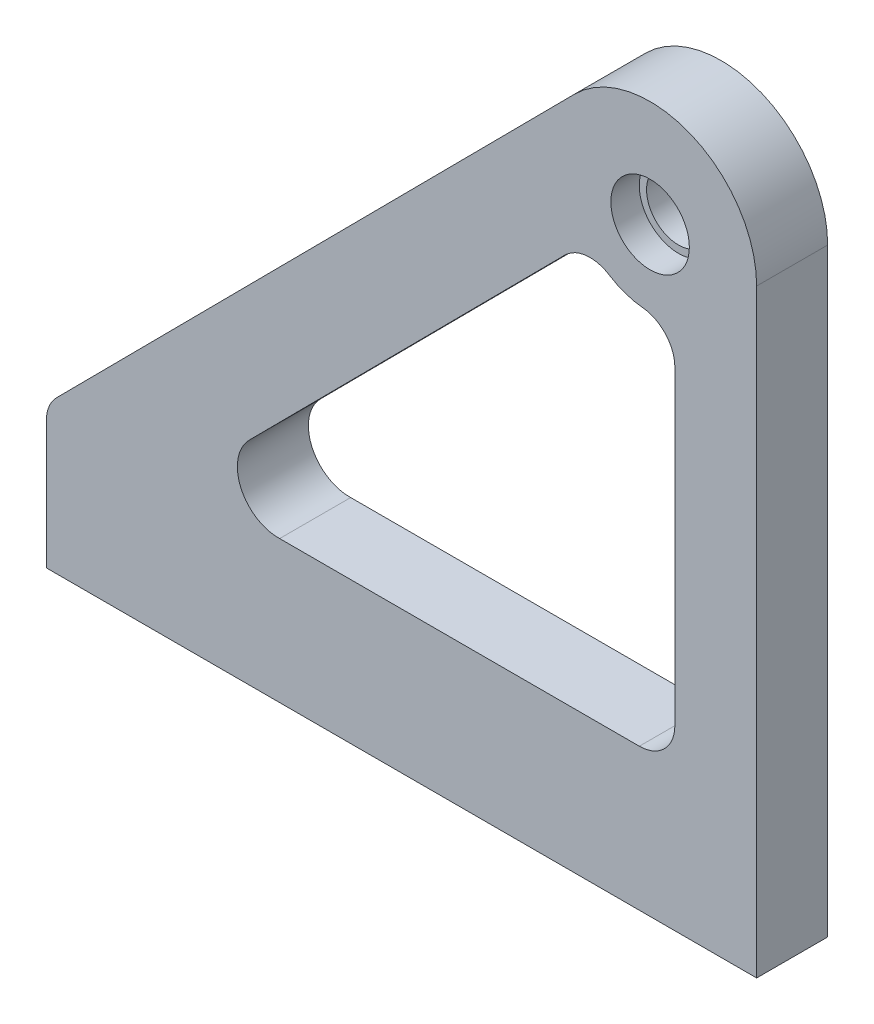
ISO-10303-21;
HEADER;
FILE_DESCRIPTION(('STEP AP214'),'2;1');
FILE_NAME('part.step','',(''),(''),'','','');
FILE_SCHEMA(('AUTOMOTIVE_DESIGN { 1 0 10303 214 1 1 1 1 }'));
ENDSEC;
DATA;
#1=APPLICATION_CONTEXT('core data for automotive mechanical design processes');
#2=APPLICATION_PROTOCOL_DEFINITION('international standard','automotive_design',2000,#1);
#3=PRODUCT_CONTEXT('',#1,'mechanical');
#4=PRODUCT('Part','Part','',(#3));
#5=PRODUCT_RELATED_PRODUCT_CATEGORY('part','',(#4));
#6=PRODUCT_DEFINITION_FORMATION('','',#4);
#7=PRODUCT_DEFINITION_CONTEXT('part definition',#1,'design');
#8=PRODUCT_DEFINITION('design','',#6,#7);
#9=PRODUCT_DEFINITION_SHAPE('','',#8);
#10=(LENGTH_UNIT() NAMED_UNIT(*) SI_UNIT(.MILLI.,.METRE.));
#11=(NAMED_UNIT(*) PLANE_ANGLE_UNIT() SI_UNIT($,.RADIAN.));
#12=(NAMED_UNIT(*) SI_UNIT($,.STERADIAN.) SOLID_ANGLE_UNIT());
#13=UNCERTAINTY_MEASURE_WITH_UNIT(LENGTH_MEASURE(1.E-05),#10,'distance_accuracy_value','');
#14=(GEOMETRIC_REPRESENTATION_CONTEXT(3) GLOBAL_UNCERTAINTY_ASSIGNED_CONTEXT((#13)) GLOBAL_UNIT_ASSIGNED_CONTEXT((#10,
#11,#12)) REPRESENTATION_CONTEXT('',''));
#15=CARTESIAN_POINT('',(0.,0.,0.));
#16=DIRECTION('',(0.,0.,1.));
#17=DIRECTION('',(1.,0.,0.));
#18=AXIS2_PLACEMENT_3D('',#15,#16,#17);
#19=CARTESIAN_POINT('',(-3.62562974974338,66.9384716413965,10.));
#20=DIRECTION('',(0.,0.,-1.));
#21=DIRECTION('',(-1.,0.,0.));
#22=AXIS2_PLACEMENT_3D('',#19,#20,#21);
#23=CYLINDRICAL_SURFACE('',#22,5.52500000000007);
#24=CARTESIAN_POINT('',(-3.62562974974338,66.9384716413965,10.));
#25=DIRECTION('',(0.,0.,1.));
#26=DIRECTION('',(1.,0.,0.));
#27=AXIS2_PLACEMENT_3D('',#24,#25,#26);
#28=CIRCLE('',#27,5.52500000000007);
#29=CARTESIAN_POINT('',(1.89937025025669,66.9384716413965,10.));
#30=VERTEX_POINT('',#29);
#31=EDGE_CURVE('E197',#30,#30,#28,.T.);
#32=ORIENTED_EDGE('',*,*,#31,.T.);
#33=EDGE_LOOP('',(#32));
#34=FACE_BOUND('',#33,.T.);
#35=CARTESIAN_POINT('',(-3.62562974974338,66.9384716413965,6.));
#36=DIRECTION('',(0.,0.,-1.));
#37=DIRECTION('',(-1.,0.,0.));
#38=AXIS2_PLACEMENT_3D('',#35,#36,#37);
#39=CIRCLE('',#38,5.52500000000006);
#40=CARTESIAN_POINT('',(-9.15062974974344,66.9384716413965,6.));
#41=VERTEX_POINT('',#40);
#42=EDGE_CURVE('E179',#41,#41,#39,.T.);
#43=ORIENTED_EDGE('',*,*,#42,.T.);
#44=EDGE_LOOP('',(#43));
#45=FACE_BOUND('',#44,.T.);
#46=ADVANCED_FACE('F41',(#34,#45),#23,.F.);
#47=CARTESIAN_POINT('',(-83.6256297497434,0.527091372309415,10.));
#48=DIRECTION('',(0.,0.,-1.));
#49=DIRECTION('',(-1.,0.,0.));
#50=AXIS2_PLACEMENT_3D('',#47,#48,#49);
#51=PLANE('',#50);
#52=DIRECTION('',(0.,-1.,0.));
#53=VECTOR('',#52,1.);
#54=CARTESIAN_POINT('',(-88.6256297497434,-17.4255036025863,10.));
#55=LINE('',#54,#53);
#56=CARTESIAN_POINT('',(-88.6256297497434,0.527091372309415,10.));
#57=VERTEX_POINT('',#56);
#58=CARTESIAN_POINT('',(-88.6256297497434,-17.4255036025863,10.));
#59=VERTEX_POINT('',#58);
#60=EDGE_CURVE('E285',#57,#59,#55,.T.);
#61=ORIENTED_EDGE('',*,*,#60,.T.);
#62=DIRECTION('',(1.,0.,0.));
#63=VECTOR('',#62,1.);
#64=CARTESIAN_POINT('',(-88.6256297497434,-17.4255036025863,10.));
#65=LINE('',#64,#63);
#66=CARTESIAN_POINT('',(11.3743702502566,-17.4255036025863,10.));
#67=VERTEX_POINT('',#66);
#68=EDGE_CURVE('E289',#59,#67,#65,.T.);
#69=ORIENTED_EDGE('',*,*,#68,.T.);
#70=DIRECTION('',(0.,1.,0.));
#71=VECTOR('',#70,1.);
#72=CARTESIAN_POINT('',(11.3743702502566,-17.4255036025863,10.));
#73=LINE('',#72,#71);
#74=CARTESIAN_POINT('',(11.3743702502566,66.9384716413965,10.));
#75=VERTEX_POINT('',#74);
#76=EDGE_CURVE('E293',#67,#75,#73,.T.);
#77=ORIENTED_EDGE('',*,*,#76,.T.);
#78=CARTESIAN_POINT('',(-3.62562974974338,66.9384716413965,10.));
#79=DIRECTION('',(0.,0.,1.));
#80=DIRECTION('',(1.,0.,0.));
#81=AXIS2_PLACEMENT_3D('',#78,#79,#80);
#82=CIRCLE('',#81,15.);
#83=CARTESIAN_POINT('',(-14.2722614936325,77.504891683682,10.));
#84=VERTEX_POINT('',#83);
#85=EDGE_CURVE('E296',#75,#84,#82,.T.);
#86=ORIENTED_EDGE('',*,*,#85,.T.);
#87=DIRECTION('',(-0.704428002819035,-0.709775449592606,0.));
#88=VECTOR('',#87,1.);
#89=CARTESIAN_POINT('',(-87.1745069977064,4.04923138640459,10.));
#90=LINE('',#89,#88);
#91=CARTESIAN_POINT('',(-87.1745069977064,4.04923138640459,10.));
#92=VERTEX_POINT('',#91);
#93=EDGE_CURVE('E299',#84,#92,#90,.T.);
#94=ORIENTED_EDGE('',*,*,#93,.T.);
#95=CARTESIAN_POINT('',(-83.6256297497434,0.527091372309415,10.));
#96=DIRECTION('',(0.,0.,1.));
#97=DIRECTION('',(-1.,0.,0.));
#98=AXIS2_PLACEMENT_3D('',#95,#96,#97);
#99=CIRCLE('',#98,5.);
#100=EDGE_CURVE('E302',#92,#57,#99,.T.);
#101=ORIENTED_EDGE('',*,*,#100,.T.);
#102=EDGE_LOOP('',(#61,#69,#77,#86,#94,#101));
#103=FACE_BOUND('',#102,.T.);
#104=CARTESIAN_POINT('',(-5.14203047411465,7.57449639741371,10.));
#105=DIRECTION('',(0.,0.,1.));
#106=DIRECTION('',(-1.,0.,0.));
#107=AXIS2_PLACEMENT_3D('',#104,#105,#106);
#108=CIRCLE('',#107,5.);
#109=CARTESIAN_POINT('',(-5.14203047411465,2.57449639741371,10.));
#110=VERTEX_POINT('',#109);
#111=CARTESIAN_POINT('',(-0.142030474114648,7.57449639741371,10.));
#112=VERTEX_POINT('',#111);
#113=EDGE_CURVE('E202',#110,#112,#108,.T.);
#114=ORIENTED_EDGE('',*,*,#113,.F.);
#115=DIRECTION('',(1.,0.,0.));
#116=VECTOR('',#115,1.);
#117=CARTESIAN_POINT('',(-5.14203047411465,2.57449639741371,10.));
#118=LINE('',#117,#116);
#119=CARTESIAN_POINT('',(-55.7765199076576,2.57449639741371,10.));
#120=VERTEX_POINT('',#119);
#121=EDGE_CURVE('E225',#120,#110,#118,.T.);
#122=ORIENTED_EDGE('',*,*,#121,.F.);
#123=CARTESIAN_POINT('',(-55.9397183034417,8.36540097019559,10.));
#124=DIRECTION('',(0.,0.,1.));
#125=DIRECTION('',(-1.,0.,0.));
#126=AXIS2_PLACEMENT_3D('',#123,#124,#125);
#127=CIRCLE('',#126,5.79320373260362);
#128=CARTESIAN_POINT('',(-60.051592087332,12.4462959054773,10.));
#129=VERTEX_POINT('',#128);
#130=EDGE_CURVE('E221',#129,#120,#127,.T.);
#131=ORIENTED_EDGE('',*,*,#130,.F.);
#132=DIRECTION('',(-0.704428002819035,-0.709775449592606,0.));
#133=VECTOR('',#132,1.);
#134=CARTESIAN_POINT('',(-60.051592087332,12.4462959054773,10.));
#135=LINE('',#134,#133);
#136=CARTESIAN_POINT('',(-15.6209090929066,57.2142606540001,10.));
#137=VERTEX_POINT('',#136);
#138=EDGE_CURVE('E218',#137,#129,#135,.T.);
#139=ORIENTED_EDGE('',*,*,#138,.F.);
#140=CARTESIAN_POINT('',(-12.0720318449436,53.6921206399049,10.));
#141=DIRECTION('',(0.,0.,1.));
#142=DIRECTION('',(-1.,0.,0.));
#143=AXIS2_PLACEMENT_3D('',#140,#141,#142);
#144=CIRCLE('',#143,4.99999999999999);
#145=CARTESIAN_POINT('',(-9.38382575983824,57.9079892389012,10.));
#146=VERTEX_POINT('',#145);
#147=EDGE_CURVE('E215',#146,#137,#144,.T.);
#148=ORIENTED_EDGE('',*,*,#147,.F.);
#149=CARTESIAN_POINT('',(-3.62562974974338,66.9384716413965,10.));
#150=DIRECTION('',(0.,0.,-1.));
#151=DIRECTION('',(1.,0.,0.));
#152=AXIS2_PLACEMENT_3D('',#149,#150,#151);
#153=CIRCLE('',#152,10.7101089496069);
#154=CARTESIAN_POINT('',(-4.65941105714071,56.2783717393822,10.));
#155=VERTEX_POINT('',#154);
#156=EDGE_CURVE('E212',#155,#146,#153,.T.);
#157=ORIENTED_EDGE('',*,*,#156,.F.);
#158=CARTESIAN_POINT('',(-5.14203047411465,51.3017183961846,10.));
#159=DIRECTION('',(0.,0.,1.));
#160=DIRECTION('',(1.,0.,0.));
#161=AXIS2_PLACEMENT_3D('',#158,#159,#160);
#162=CIRCLE('',#161,5.);
#163=CARTESIAN_POINT('',(-0.142030474114655,51.3017183961846,10.));
#164=VERTEX_POINT('',#163);
#165=EDGE_CURVE('E209',#164,#155,#162,.T.);
#166=ORIENTED_EDGE('',*,*,#165,.F.);
#167=DIRECTION('',(0.,1.,0.));
#168=VECTOR('',#167,1.);
#169=CARTESIAN_POINT('',(-0.142030474114655,51.3017183961846,10.));
#170=LINE('',#169,#168);
#171=EDGE_CURVE('E205',#112,#164,#170,.T.);
#172=ORIENTED_EDGE('',*,*,#171,.F.);
#173=EDGE_LOOP('',(#114,#122,#131,#139,#148,#157,#166,#172));
#174=FACE_BOUND('',#173,.T.);
#175=ORIENTED_EDGE('',*,*,#31,.F.);
#176=EDGE_LOOP('',(#175));
#177=FACE_BOUND('',#176,.T.);
#178=ADVANCED_FACE('F381',(#103,#174,#177),#51,.F.);
#179=CARTESIAN_POINT('',(-83.6256297497434,0.527091372309415,0.));
#180=DIRECTION('',(0.,0.,-1.));
#181=DIRECTION('',(-1.,0.,0.));
#182=AXIS2_PLACEMENT_3D('',#179,#180,#181);
#183=PLANE('',#182);
#184=DIRECTION('',(0.,-1.,0.));
#185=VECTOR('',#184,1.);
#186=CARTESIAN_POINT('',(-74.1517472077,-10.4255036025863,0.));
#187=LINE('',#186,#185);
#188=CARTESIAN_POINT('',(-74.1517472077,-10.4255036025863,0.));
#189=VERTEX_POINT('',#188);
#190=CARTESIAN_POINT('',(-74.1517472077,-17.4255036025863,0.));
#191=VERTEX_POINT('',#190);
#192=EDGE_CURVE('E65',#189,#191,#187,.T.);
#193=ORIENTED_EDGE('',*,*,#192,.F.);
#194=DIRECTION('',(-1.,0.,0.));
#195=VECTOR('',#194,1.);
#196=CARTESIAN_POINT('',(-83.6256297497434,-10.4255036025863,0.));
#197=LINE('',#196,#195);
#198=CARTESIAN_POINT('',(-83.0995122917867,-10.4255036025863,0.));
#199=VERTEX_POINT('',#198);
#200=EDGE_CURVE('E11',#189,#199,#197,.T.);
#201=ORIENTED_EDGE('',*,*,#200,.T.);
#202=DIRECTION('',(0.,-1.,0.));
#203=VECTOR('',#202,1.);
#204=CARTESIAN_POINT('',(-83.0995122917867,-10.4255036025863,0.));
#205=LINE('',#204,#203);
#206=CARTESIAN_POINT('',(-83.0995122917867,-17.4255036025863,0.));
#207=VERTEX_POINT('',#206);
#208=EDGE_CURVE('E187',#207,#199,#205,.F.);
#209=ORIENTED_EDGE('',*,*,#208,.F.);
#210=DIRECTION('',(1.,0.,0.));
#211=VECTOR('',#210,1.);
#212=CARTESIAN_POINT('',(-88.6256297497434,-17.4255036025863,0.));
#213=LINE('',#212,#211);
#214=CARTESIAN_POINT('',(-88.6256297497434,-17.4255036025863,0.));
#215=VERTEX_POINT('',#214);
#216=EDGE_CURVE('E309',#215,#207,#213,.T.);
#217=ORIENTED_EDGE('',*,*,#216,.F.);
#218=DIRECTION('',(0.,-1.,0.));
#219=VECTOR('',#218,1.);
#220=CARTESIAN_POINT('',(-88.6256297497434,-17.4255036025863,0.));
#221=LINE('',#220,#219);
#222=CARTESIAN_POINT('',(-88.6256297497434,0.527091372309415,0.));
#223=VERTEX_POINT('',#222);
#224=EDGE_CURVE('E284',#223,#215,#221,.T.);
#225=ORIENTED_EDGE('',*,*,#224,.F.);
#226=CARTESIAN_POINT('',(-83.6256297497434,0.527091372309415,0.));
#227=DIRECTION('',(0.,0.,1.));
#228=DIRECTION('',(-1.,0.,0.));
#229=AXIS2_PLACEMENT_3D('',#226,#227,#228);
#230=CIRCLE('',#229,5.);
#231=CARTESIAN_POINT('',(-87.1745069977064,4.04923138640459,0.));
#232=VERTEX_POINT('',#231);
#233=EDGE_CURVE('E290',#232,#223,#230,.T.);
#234=ORIENTED_EDGE('',*,*,#233,.F.);
#235=DIRECTION('',(-0.704428002819035,-0.709775449592606,0.));
#236=VECTOR('',#235,1.);
#237=CARTESIAN_POINT('',(-87.1745069977064,4.04923138640459,0.));
#238=LINE('',#237,#236);
#239=CARTESIAN_POINT('',(-14.2722614936325,77.504891683682,0.));
#240=VERTEX_POINT('',#239);
#241=EDGE_CURVE('E320',#240,#232,#238,.T.);
#242=ORIENTED_EDGE('',*,*,#241,.F.);
#243=CARTESIAN_POINT('',(-3.62562974974338,66.9384716413965,0.));
#244=DIRECTION('',(0.,0.,1.));
#245=DIRECTION('',(1.,0.,0.));
#246=AXIS2_PLACEMENT_3D('',#243,#244,#245);
#247=CIRCLE('',#246,15.);
#248=CARTESIAN_POINT('',(11.3743702502566,66.9384716413965,0.));
#249=VERTEX_POINT('',#248);
#250=EDGE_CURVE('E317',#249,#240,#247,.T.);
#251=ORIENTED_EDGE('',*,*,#250,.F.);
#252=DIRECTION('',(0.,1.,0.));
#253=VECTOR('',#252,1.);
#254=CARTESIAN_POINT('',(11.3743702502566,2.5744963974137,0.));
#255=LINE('',#254,#253);
#256=CARTESIAN_POINT('',(11.3743702502566,-17.4255036025863,0.));
#257=VERTEX_POINT('',#256);
#258=EDGE_CURVE('E313',#257,#249,#255,.T.);
#259=ORIENTED_EDGE('',*,*,#258,.F.);
#260=CARTESIAN_POINT('',(5.84825279229994,-17.4255036025863,0.));
#261=VERTEX_POINT('',#260);
#262=EDGE_CURVE('E185',#261,#257,#213,.T.);
#263=ORIENTED_EDGE('',*,*,#262,.F.);
#264=DIRECTION('',(0.,-1.,0.));
#265=VECTOR('',#264,1.);
#266=CARTESIAN_POINT('',(5.84825279229994,-10.4255036025863,0.));
#267=LINE('',#266,#265);
#268=CARTESIAN_POINT('',(5.84825279229994,-10.4255036025863,0.));
#269=VERTEX_POINT('',#268);
#270=EDGE_CURVE('E57',#269,#261,#267,.T.);
#271=ORIENTED_EDGE('',*,*,#270,.F.);
#272=DIRECTION('',(-1.,0.,0.));
#273=VECTOR('',#272,1.);
#274=CARTESIAN_POINT('',(-83.6256297497434,-10.4255036025863,0.));
#275=LINE('',#274,#273);
#276=CARTESIAN_POINT('',(-3.0995122917867,-10.4255036025863,0.));
#277=VERTEX_POINT('',#276);
#278=EDGE_CURVE('E50',#269,#277,#275,.T.);
#279=ORIENTED_EDGE('',*,*,#278,.T.);
#280=DIRECTION('',(0.,-1.,0.));
#281=VECTOR('',#280,1.);
#282=CARTESIAN_POINT('',(-3.0995122917867,-10.4255036025863,0.));
#283=LINE('',#282,#281);
#284=CARTESIAN_POINT('',(-3.0995122917867,-17.4255036025863,0.));
#285=VERTEX_POINT('',#284);
#286=EDGE_CURVE('E176',#285,#277,#283,.F.);
#287=ORIENTED_EDGE('',*,*,#286,.F.);
#288=EDGE_CURVE('E314',#191,#285,#213,.T.);
#289=ORIENTED_EDGE('',*,*,#288,.F.);
#290=EDGE_LOOP('',(#193,#201,#209,#217,#225,#234,#242,#251,#259,#263,#271,#279,#287,#289));
#291=FACE_BOUND('',#290,.T.);
#292=DIRECTION('',(1.,0.,0.));
#293=VECTOR('',#292,1.);
#294=CARTESIAN_POINT('',(-5.14203047411465,2.57449639741371,0.));
#295=LINE('',#294,#293);
#296=CARTESIAN_POINT('',(-55.7765199076576,2.57449639741371,0.));
#297=VERTEX_POINT('',#296);
#298=CARTESIAN_POINT('',(-5.14203047411464,2.57449639741371,0.));
#299=VERTEX_POINT('',#298);
#300=EDGE_CURVE('E206',#297,#299,#295,.T.);
#301=ORIENTED_EDGE('',*,*,#300,.T.);
#302=CARTESIAN_POINT('',(-5.14203047411465,7.57449639741371,0.));
#303=DIRECTION('',(0.,0.,1.));
#304=DIRECTION('',(-1.,0.,0.));
#305=AXIS2_PLACEMENT_3D('',#302,#303,#304);
#306=CIRCLE('',#305,5.);
#307=CARTESIAN_POINT('',(-0.142030474114648,7.57449639741371,0.));
#308=VERTEX_POINT('',#307);
#309=EDGE_CURVE('E201',#299,#308,#306,.T.);
#310=ORIENTED_EDGE('',*,*,#309,.T.);
#311=DIRECTION('',(0.,1.,0.));
#312=VECTOR('',#311,1.);
#313=CARTESIAN_POINT('',(-0.142030474114655,51.3017183961846,0.));
#314=LINE('',#313,#312);
#315=CARTESIAN_POINT('',(-0.142030474114655,51.3017183961846,0.));
#316=VERTEX_POINT('',#315);
#317=EDGE_CURVE('E232',#308,#316,#314,.T.);
#318=ORIENTED_EDGE('',*,*,#317,.T.);
#319=CARTESIAN_POINT('',(-5.14203047411465,51.3017183961846,0.));
#320=DIRECTION('',(0.,0.,1.));
#321=DIRECTION('',(1.,0.,0.));
#322=AXIS2_PLACEMENT_3D('',#319,#320,#321);
#323=CIRCLE('',#322,5.);
#324=CARTESIAN_POINT('',(-4.65941105714071,56.2783717393822,0.));
#325=VERTEX_POINT('',#324);
#326=EDGE_CURVE('E236',#316,#325,#323,.T.);
#327=ORIENTED_EDGE('',*,*,#326,.T.);
#328=CARTESIAN_POINT('',(-3.62562974974338,66.9384716413965,0.));
#329=DIRECTION('',(0.,0.,-1.));
#330=DIRECTION('',(1.,0.,0.));
#331=AXIS2_PLACEMENT_3D('',#328,#329,#330);
#332=CIRCLE('',#331,10.7101089496069);
#333=CARTESIAN_POINT('',(-9.38382575983824,57.9079892389012,0.));
#334=VERTEX_POINT('',#333);
#335=EDGE_CURVE('E240',#325,#334,#332,.T.);
#336=ORIENTED_EDGE('',*,*,#335,.T.);
#337=CARTESIAN_POINT('',(-12.0720318449436,53.6921206399049,0.));
#338=DIRECTION('',(0.,0.,1.));
#339=DIRECTION('',(-1.,0.,0.));
#340=AXIS2_PLACEMENT_3D('',#337,#338,#339);
#341=CIRCLE('',#340,4.99999999999999);
#342=CARTESIAN_POINT('',(-15.6209090929066,57.2142606540001,0.));
#343=VERTEX_POINT('',#342);
#344=EDGE_CURVE('E244',#334,#343,#341,.T.);
#345=ORIENTED_EDGE('',*,*,#344,.T.);
#346=DIRECTION('',(-0.704428002819035,-0.709775449592606,0.));
#347=VECTOR('',#346,1.);
#348=CARTESIAN_POINT('',(-60.051592087332,12.4462959054773,0.));
#349=LINE('',#348,#347);
#350=CARTESIAN_POINT('',(-60.051592087332,12.4462959054773,0.));
#351=VERTEX_POINT('',#350);
#352=EDGE_CURVE('E248',#343,#351,#349,.T.);
#353=ORIENTED_EDGE('',*,*,#352,.T.);
#354=CARTESIAN_POINT('',(-55.9397183034417,8.36540097019559,0.));
#355=DIRECTION('',(0.,0.,1.));
#356=DIRECTION('',(-1.,0.,0.));
#357=AXIS2_PLACEMENT_3D('',#354,#355,#356);
#358=CIRCLE('',#357,5.79320373260362);
#359=EDGE_CURVE('E252',#351,#297,#358,.T.);
#360=ORIENTED_EDGE('',*,*,#359,.T.);
#361=EDGE_LOOP('',(#301,#310,#318,#327,#336,#345,#353,#360));
#362=FACE_BOUND('',#361,.T.);
#363=CARTESIAN_POINT('',(-3.62562974974338,66.9384716413965,0.));
#364=DIRECTION('',(0.,0.,-1.));
#365=DIRECTION('',(-1.,0.,0.));
#366=AXIS2_PLACEMENT_3D('',#363,#364,#365);
#367=CIRCLE('',#366,4.5);
#368=CARTESIAN_POINT('',(-8.12562974974338,66.9384716413965,0.));
#369=VERTEX_POINT('',#368);
#370=EDGE_CURVE('E609',#369,#369,#367,.T.);
#371=ORIENTED_EDGE('',*,*,#370,.F.);
#372=EDGE_LOOP('',(#371));
#373=FACE_BOUND('',#372,.T.);
#374=ADVANCED_FACE('F182',(#291,#362,#373),#183,.T.);
#375=CARTESIAN_POINT('',(-88.6256297497434,-17.4255036025863,10.));
#376=DIRECTION('',(1.,0.,0.));
#377=DIRECTION('',(0.,0.,-1.));
#378=AXIS2_PLACEMENT_3D('',#375,#376,#377);
#379=PLANE('',#378);
#380=ORIENTED_EDGE('',*,*,#224,.T.);
#381=DIRECTION('',(0.,0.,-1.));
#382=VECTOR('',#381,1.);
#383=CARTESIAN_POINT('',(-88.6256297497434,-17.4255036025863,10.));
#384=LINE('',#383,#382);
#385=EDGE_CURVE('E174',#59,#215,#384,.T.);
#386=ORIENTED_EDGE('',*,*,#385,.F.);
#387=ORIENTED_EDGE('',*,*,#60,.F.);
#388=DIRECTION('',(0.,0.,-1.));
#389=VECTOR('',#388,1.);
#390=CARTESIAN_POINT('',(-88.6256297497434,0.527091372309415,10.));
#391=LINE('',#390,#389);
#392=EDGE_CURVE('E305',#57,#223,#391,.T.);
#393=ORIENTED_EDGE('',*,*,#392,.T.);
#394=EDGE_LOOP('',(#380,#386,#387,#393));
#395=FACE_BOUND('',#394,.T.);
#396=ADVANCED_FACE('F43',(#395),#379,.F.);
#397=CARTESIAN_POINT('',(-88.6256297497434,-17.4255036025863,10.));
#398=DIRECTION('',(0.,1.,0.));
#399=DIRECTION('',(0.,0.,1.));
#400=AXIS2_PLACEMENT_3D('',#397,#398,#399);
#401=PLANE('',#400);
#402=ORIENTED_EDGE('',*,*,#216,.T.);
#403=CARTESIAN_POINT('',(-78.6256297497434,-17.4255036025863,2.5));
#404=DIRECTION('',(0.,-1.,0.));
#405=DIRECTION('',(0.,0.,-1.));
#406=AXIS2_PLACEMENT_3D('',#403,#404,#405);
#407=CIRCLE('',#406,5.12500000000001);
#408=EDGE_CURVE('E359',#191,#207,#407,.T.);
#409=ORIENTED_EDGE('',*,*,#408,.F.);
#410=ORIENTED_EDGE('',*,*,#288,.T.);
#411=CARTESIAN_POINT('',(1.37437025025662,-17.4255036025863,2.5));
#412=DIRECTION('',(0.,-1.,0.));
#413=DIRECTION('',(0.,0.,-1.));
#414=AXIS2_PLACEMENT_3D('',#411,#412,#413);
#415=CIRCLE('',#414,5.125);
#416=EDGE_CURVE('E178',#261,#285,#415,.T.);
#417=ORIENTED_EDGE('',*,*,#416,.F.);
#418=ORIENTED_EDGE('',*,*,#262,.T.);
#419=DIRECTION('',(0.,0.,-1.));
#420=VECTOR('',#419,1.);
#421=CARTESIAN_POINT('',(11.3743702502566,-17.4255036025863,10.));
#422=LINE('',#421,#420);
#423=EDGE_CURVE('E340',#67,#257,#422,.T.);
#424=ORIENTED_EDGE('',*,*,#423,.F.);
#425=ORIENTED_EDGE('',*,*,#68,.F.);
#426=ORIENTED_EDGE('',*,*,#385,.T.);
#427=EDGE_LOOP('',(#402,#409,#410,#417,#418,#424,#425,#426));
#428=FACE_BOUND('',#427,.T.);
#429=ADVANCED_FACE('F348',(#428),#401,.F.);
#430=CARTESIAN_POINT('',(11.3743702502566,2.5744963974137,10.));
#431=DIRECTION('',(-1.,0.,0.));
#432=DIRECTION('',(0.,-1.,0.));
#433=AXIS2_PLACEMENT_3D('',#430,#431,#432);
#434=PLANE('',#433);
#435=ORIENTED_EDGE('',*,*,#258,.T.);
#436=DIRECTION('',(0.,0.,-1.));
#437=VECTOR('',#436,1.);
#438=CARTESIAN_POINT('',(11.3743702502566,66.9384716413965,10.));
#439=LINE('',#438,#437);
#440=EDGE_CURVE('E336',#75,#249,#439,.T.);
#441=ORIENTED_EDGE('',*,*,#440,.F.);
#442=ORIENTED_EDGE('',*,*,#76,.F.);
#443=ORIENTED_EDGE('',*,*,#423,.T.);
#444=EDGE_LOOP('',(#435,#441,#442,#443));
#445=FACE_BOUND('',#444,.T.);
#446=ADVANCED_FACE('F378',(#445),#434,.F.);
#447=CARTESIAN_POINT('',(-3.62562974974338,66.9384716413965,10.));
#448=DIRECTION('',(0.,0.,-1.));
#449=DIRECTION('',(-1.,0.,0.));
#450=AXIS2_PLACEMENT_3D('',#447,#448,#449);
#451=CYLINDRICAL_SURFACE('',#450,15.);
#452=ORIENTED_EDGE('',*,*,#250,.T.);
#453=DIRECTION('',(0.,0.,-1.));
#454=VECTOR('',#453,1.);
#455=CARTESIAN_POINT('',(-14.2722614936325,77.504891683682,10.));
#456=LINE('',#455,#454);
#457=EDGE_CURVE('E332',#84,#240,#456,.T.);
#458=ORIENTED_EDGE('',*,*,#457,.F.);
#459=ORIENTED_EDGE('',*,*,#85,.F.);
#460=ORIENTED_EDGE('',*,*,#440,.T.);
#461=EDGE_LOOP('',(#452,#458,#459,#460));
#462=FACE_BOUND('',#461,.T.);
#463=ADVANCED_FACE('F392',(#462),#451,.T.);
#464=CARTESIAN_POINT('',(-87.1745069977064,4.04923138640459,10.));
#465=DIRECTION('',(0.709775449592606,-0.704428002819035,0.));
#466=DIRECTION('',(0.704428002819035,0.709775449592606,0.));
#467=AXIS2_PLACEMENT_3D('',#464,#465,#466);
#468=PLANE('',#467);
#469=ORIENTED_EDGE('',*,*,#241,.T.);
#470=DIRECTION('',(0.,0.,-1.));
#471=VECTOR('',#470,1.);
#472=CARTESIAN_POINT('',(-87.1745069977064,4.04923138640459,10.));
#473=LINE('',#472,#471);
#474=EDGE_CURVE('E328',#92,#232,#473,.T.);
#475=ORIENTED_EDGE('',*,*,#474,.F.);
#476=ORIENTED_EDGE('',*,*,#93,.F.);
#477=ORIENTED_EDGE('',*,*,#457,.T.);
#478=EDGE_LOOP('',(#469,#475,#476,#477));
#479=FACE_BOUND('',#478,.T.);
#480=ADVANCED_FACE('F390',(#479),#468,.F.);
#481=CARTESIAN_POINT('',(-83.6256297497434,0.527091372309415,10.));
#482=DIRECTION('',(0.,0.,-1.));
#483=DIRECTION('',(-1.,0.,0.));
#484=AXIS2_PLACEMENT_3D('',#481,#482,#483);
#485=CYLINDRICAL_SURFACE('',#484,5.);
#486=ORIENTED_EDGE('',*,*,#233,.T.);
#487=ORIENTED_EDGE('',*,*,#392,.F.);
#488=ORIENTED_EDGE('',*,*,#100,.F.);
#489=ORIENTED_EDGE('',*,*,#474,.T.);
#490=EDGE_LOOP('',(#486,#487,#488,#489));
#491=FACE_BOUND('',#490,.T.);
#492=ADVANCED_FACE('F388',(#491),#485,.T.);
#493=CARTESIAN_POINT('',(-5.14203047411465,7.57449639741371,10.));
#494=DIRECTION('',(0.,0.,-1.));
#495=DIRECTION('',(-1.,0.,0.));
#496=AXIS2_PLACEMENT_3D('',#493,#494,#495);
#497=CYLINDRICAL_SURFACE('',#496,5.);
#498=ORIENTED_EDGE('',*,*,#309,.F.);
#499=DIRECTION('',(0.,0.,-1.));
#500=VECTOR('',#499,1.);
#501=CARTESIAN_POINT('',(-5.14203047411465,2.57449639741371,10.));
#502=LINE('',#501,#500);
#503=EDGE_CURVE('E228',#110,#299,#502,.T.);
#504=ORIENTED_EDGE('',*,*,#503,.F.);
#505=ORIENTED_EDGE('',*,*,#113,.T.);
#506=DIRECTION('',(0.,0.,-1.));
#507=VECTOR('',#506,1.);
#508=CARTESIAN_POINT('',(-0.142030474114648,7.57449639741371,10.));
#509=LINE('',#508,#507);
#510=EDGE_CURVE('E280',#112,#308,#509,.T.);
#511=ORIENTED_EDGE('',*,*,#510,.T.);
#512=EDGE_LOOP('',(#498,#504,#505,#511));
#513=FACE_BOUND('',#512,.T.);
#514=ADVANCED_FACE('F439',(#513),#497,.F.);
#515=CARTESIAN_POINT('',(-0.142030474114655,51.3017183961846,10.));
#516=DIRECTION('',(-1.,0.,0.));
#517=DIRECTION('',(0.,-1.,0.));
#518=AXIS2_PLACEMENT_3D('',#515,#516,#517);
#519=PLANE('',#518);
#520=ORIENTED_EDGE('',*,*,#317,.F.);
#521=ORIENTED_EDGE('',*,*,#510,.F.);
#522=ORIENTED_EDGE('',*,*,#171,.T.);
#523=DIRECTION('',(0.,0.,-1.));
#524=VECTOR('',#523,1.);
#525=CARTESIAN_POINT('',(-0.142030474114655,51.3017183961846,10.));
#526=LINE('',#525,#524);
#527=EDGE_CURVE('E277',#164,#316,#526,.T.);
#528=ORIENTED_EDGE('',*,*,#527,.T.);
#529=EDGE_LOOP('',(#520,#521,#522,#528));
#530=FACE_BOUND('',#529,.T.);
#531=ADVANCED_FACE('F435',(#530),#519,.T.);
#532=CARTESIAN_POINT('',(-5.14203047411465,51.3017183961846,10.));
#533=DIRECTION('',(0.,0.,-1.));
#534=DIRECTION('',(-1.,0.,0.));
#535=AXIS2_PLACEMENT_3D('',#532,#533,#534);
#536=CYLINDRICAL_SURFACE('',#535,5.);
#537=ORIENTED_EDGE('',*,*,#326,.F.);
#538=ORIENTED_EDGE('',*,*,#527,.F.);
#539=ORIENTED_EDGE('',*,*,#165,.T.);
#540=DIRECTION('',(0.,0.,-1.));
#541=VECTOR('',#540,1.);
#542=CARTESIAN_POINT('',(-4.65941105714071,56.2783717393822,10.));
#543=LINE('',#542,#541);
#544=EDGE_CURVE('E274',#155,#325,#543,.T.);
#545=ORIENTED_EDGE('',*,*,#544,.T.);
#546=EDGE_LOOP('',(#537,#538,#539,#545));
#547=FACE_BOUND('',#546,.T.);
#548=ADVANCED_FACE('F431',(#547),#536,.F.);
#549=CARTESIAN_POINT('',(-3.62562974974338,66.9384716413965,10.));
#550=DIRECTION('',(0.,0.,-1.));
#551=DIRECTION('',(-1.,0.,0.));
#552=AXIS2_PLACEMENT_3D('',#549,#550,#551);
#553=CYLINDRICAL_SURFACE('',#552,10.7101089496069);
#554=ORIENTED_EDGE('',*,*,#335,.F.);
#555=ORIENTED_EDGE('',*,*,#544,.F.);
#556=ORIENTED_EDGE('',*,*,#156,.T.);
#557=DIRECTION('',(0.,0.,-1.));
#558=VECTOR('',#557,1.);
#559=CARTESIAN_POINT('',(-9.38382575983824,57.9079892389012,10.));
#560=LINE('',#559,#558);
#561=EDGE_CURVE('E271',#146,#334,#560,.T.);
#562=ORIENTED_EDGE('',*,*,#561,.T.);
#563=EDGE_LOOP('',(#554,#555,#556,#562));
#564=FACE_BOUND('',#563,.T.);
#565=ADVANCED_FACE('F427',(#564),#553,.T.);
#566=CARTESIAN_POINT('',(-12.0720318449436,53.6921206399049,10.));
#567=DIRECTION('',(0.,0.,-1.));
#568=DIRECTION('',(-1.,0.,0.));
#569=AXIS2_PLACEMENT_3D('',#566,#567,#568);
#570=CYLINDRICAL_SURFACE('',#569,4.99999999999999);
#571=ORIENTED_EDGE('',*,*,#344,.F.);
#572=ORIENTED_EDGE('',*,*,#561,.F.);
#573=ORIENTED_EDGE('',*,*,#147,.T.);
#574=DIRECTION('',(0.,0.,-1.));
#575=VECTOR('',#574,1.);
#576=CARTESIAN_POINT('',(-15.6209090929066,57.2142606540001,10.));
#577=LINE('',#576,#575);
#578=EDGE_CURVE('E268',#137,#343,#577,.T.);
#579=ORIENTED_EDGE('',*,*,#578,.T.);
#580=EDGE_LOOP('',(#571,#572,#573,#579));
#581=FACE_BOUND('',#580,.T.);
#582=ADVANCED_FACE('F423',(#581),#570,.F.);
#583=CARTESIAN_POINT('',(-60.051592087332,12.4462959054773,10.));
#584=DIRECTION('',(0.709775449592606,-0.704428002819035,0.));
#585=DIRECTION('',(0.704428002819035,0.709775449592606,0.));
#586=AXIS2_PLACEMENT_3D('',#583,#584,#585);
#587=PLANE('',#586);
#588=ORIENTED_EDGE('',*,*,#352,.F.);
#589=ORIENTED_EDGE('',*,*,#578,.F.);
#590=ORIENTED_EDGE('',*,*,#138,.T.);
#591=DIRECTION('',(0.,0.,-1.));
#592=VECTOR('',#591,1.);
#593=CARTESIAN_POINT('',(-60.051592087332,12.4462959054773,10.));
#594=LINE('',#593,#592);
#595=EDGE_CURVE('E265',#129,#351,#594,.T.);
#596=ORIENTED_EDGE('',*,*,#595,.T.);
#597=EDGE_LOOP('',(#588,#589,#590,#596));
#598=FACE_BOUND('',#597,.T.);
#599=ADVANCED_FACE('F419',(#598),#587,.T.);
#600=CARTESIAN_POINT('',(-55.9397183034417,8.36540097019559,10.));
#601=DIRECTION('',(0.,0.,-1.));
#602=DIRECTION('',(-1.,0.,0.));
#603=AXIS2_PLACEMENT_3D('',#600,#601,#602);
#604=CYLINDRICAL_SURFACE('',#603,5.79320373260362);
#605=ORIENTED_EDGE('',*,*,#359,.F.);
#606=ORIENTED_EDGE('',*,*,#595,.F.);
#607=ORIENTED_EDGE('',*,*,#130,.T.);
#608=DIRECTION('',(0.,0.,-1.));
#609=VECTOR('',#608,1.);
#610=CARTESIAN_POINT('',(-55.7765199076576,2.57449639741371,10.));
#611=LINE('',#610,#609);
#612=EDGE_CURVE('E262',#120,#297,#611,.T.);
#613=ORIENTED_EDGE('',*,*,#612,.T.);
#614=EDGE_LOOP('',(#605,#606,#607,#613));
#615=FACE_BOUND('',#614,.T.);
#616=ADVANCED_FACE('F415',(#615),#604,.F.);
#617=CARTESIAN_POINT('',(-5.14203047411465,2.57449639741371,10.));
#618=DIRECTION('',(0.,1.,0.));
#619=DIRECTION('',(-1.,0.,0.));
#620=AXIS2_PLACEMENT_3D('',#617,#618,#619);
#621=PLANE('',#620);
#622=ORIENTED_EDGE('',*,*,#300,.F.);
#623=ORIENTED_EDGE('',*,*,#612,.F.);
#624=ORIENTED_EDGE('',*,*,#121,.T.);
#625=ORIENTED_EDGE('',*,*,#503,.T.);
#626=EDGE_LOOP('',(#622,#623,#624,#625));
#627=FACE_BOUND('',#626,.T.);
#628=ADVANCED_FACE('F412',(#627),#621,.T.);
#629=CARTESIAN_POINT('',(1.37437025025662,-10.4255036025863,2.5));
#630=DIRECTION('',(0.,-1.,0.));
#631=DIRECTION('',(0.,0.,-1.));
#632=AXIS2_PLACEMENT_3D('',#629,#630,#631);
#633=CYLINDRICAL_SURFACE('',#632,5.125);
#634=ORIENTED_EDGE('',*,*,#270,.T.);
#635=ORIENTED_EDGE('',*,*,#416,.T.);
#636=ORIENTED_EDGE('',*,*,#286,.T.);
#637=CARTESIAN_POINT('',(1.37437025025662,-10.4255036025863,2.5));
#638=DIRECTION('',(0.,-1.,0.));
#639=DIRECTION('',(0.,0.,-1.));
#640=AXIS2_PLACEMENT_3D('',#637,#638,#639);
#641=CIRCLE('',#640,5.125);
#642=EDGE_CURVE('E170',#269,#277,#641,.T.);
#643=ORIENTED_EDGE('',*,*,#642,.F.);
#644=EDGE_LOOP('',(#634,#635,#636,#643));
#645=FACE_BOUND('',#644,.T.);
#646=ADVANCED_FACE('F175',(#645),#633,.F.);
#647=CARTESIAN_POINT('',(1.37437025025662,-10.4255036025863,2.5));
#648=DIRECTION('',(0.,-1.,0.));
#649=DIRECTION('',(0.,0.,-1.));
#650=AXIS2_PLACEMENT_3D('',#647,#648,#649);
#651=PLANE('',#650);
#652=ORIENTED_EDGE('',*,*,#642,.T.);
#653=ORIENTED_EDGE('',*,*,#278,.F.);
#654=EDGE_LOOP('',(#652,#653));
#655=FACE_BOUND('',#654,.T.);
#656=ADVANCED_FACE('F169',(#655),#651,.T.);
#657=CARTESIAN_POINT('',(-78.6256297497434,-10.4255036025863,2.5));
#658=DIRECTION('',(0.,-1.,0.));
#659=DIRECTION('',(0.,0.,-1.));
#660=AXIS2_PLACEMENT_3D('',#657,#658,#659);
#661=CYLINDRICAL_SURFACE('',#660,5.12500000000001);
#662=ORIENTED_EDGE('',*,*,#192,.T.);
#663=ORIENTED_EDGE('',*,*,#408,.T.);
#664=ORIENTED_EDGE('',*,*,#208,.T.);
#665=CARTESIAN_POINT('',(-78.6256297497434,-10.4255036025863,2.5));
#666=DIRECTION('',(0.,-1.,0.));
#667=DIRECTION('',(0.,0.,-1.));
#668=AXIS2_PLACEMENT_3D('',#665,#666,#667);
#669=CIRCLE('',#668,5.12500000000001);
#670=EDGE_CURVE('E192',#189,#199,#669,.T.);
#671=ORIENTED_EDGE('',*,*,#670,.F.);
#672=EDGE_LOOP('',(#662,#663,#664,#671));
#673=FACE_BOUND('',#672,.T.);
#674=ADVANCED_FACE('F358',(#673),#661,.F.);
#675=CARTESIAN_POINT('',(-78.6256297497434,-10.4255036025863,2.5));
#676=DIRECTION('',(0.,-1.,0.));
#677=DIRECTION('',(0.,0.,-1.));
#678=AXIS2_PLACEMENT_3D('',#675,#676,#677);
#679=PLANE('',#678);
#680=ORIENTED_EDGE('',*,*,#670,.T.);
#681=ORIENTED_EDGE('',*,*,#200,.F.);
#682=EDGE_LOOP('',(#680,#681));
#683=FACE_BOUND('',#682,.T.);
#684=ADVANCED_FACE('F361',(#683),#679,.T.);
#685=CARTESIAN_POINT('',(-3.62562974974338,66.9384716413965,6.));
#686=DIRECTION('',(0.,0.,-1.));
#687=DIRECTION('',(-1.,0.,0.));
#688=AXIS2_PLACEMENT_3D('',#685,#686,#687);
#689=PLANE('',#688);
#690=CARTESIAN_POINT('',(-3.62562974974338,66.9384716413965,6.));
#691=DIRECTION('',(0.,0.,-1.));
#692=DIRECTION('',(-1.,0.,0.));
#693=AXIS2_PLACEMENT_3D('',#690,#691,#692);
#694=CIRCLE('',#693,4.5);
#695=CARTESIAN_POINT('',(-8.12562974974338,66.9384716413965,6.));
#696=VERTEX_POINT('',#695);
#697=EDGE_CURVE('E606',#696,#696,#694,.T.);
#698=ORIENTED_EDGE('',*,*,#697,.T.);
#699=EDGE_LOOP('',(#698));
#700=FACE_BOUND('',#699,.T.);
#701=ORIENTED_EDGE('',*,*,#42,.F.);
#702=EDGE_LOOP('',(#701));
#703=FACE_BOUND('',#702,.T.);
#704=ADVANCED_FACE('F506',(#700,#703),#689,.F.);
#705=CARTESIAN_POINT('',(-3.62562974974338,66.9384716413965,6.));
#706=DIRECTION('',(0.,0.,-1.));
#707=DIRECTION('',(-1.,0.,0.));
#708=AXIS2_PLACEMENT_3D('',#705,#706,#707);
#709=CYLINDRICAL_SURFACE('',#708,4.5);
#710=ORIENTED_EDGE('',*,*,#697,.F.);
#711=EDGE_LOOP('',(#710));
#712=FACE_BOUND('',#711,.T.);
#713=ORIENTED_EDGE('',*,*,#370,.T.);
#714=EDGE_LOOP('',(#713));
#715=FACE_BOUND('',#714,.T.);
#716=ADVANCED_FACE('F513',(#712,#715),#709,.F.);
#717=CLOSED_SHELL('',(#46,#178,#374,#396,#429,#446,#463,#480,#492,#514,#531,#548,#565,#582,#599,
#616,#628,#646,#656,#674,#684,#704,#716));
#718=MANIFOLD_SOLID_BREP('B2',#717);
#719=ADVANCED_BREP_SHAPE_REPRESENTATION('',(#18,#718),#14);
#720=SHAPE_DEFINITION_REPRESENTATION(#9,#719);
ENDSEC;
END-ISO-10303-21;
